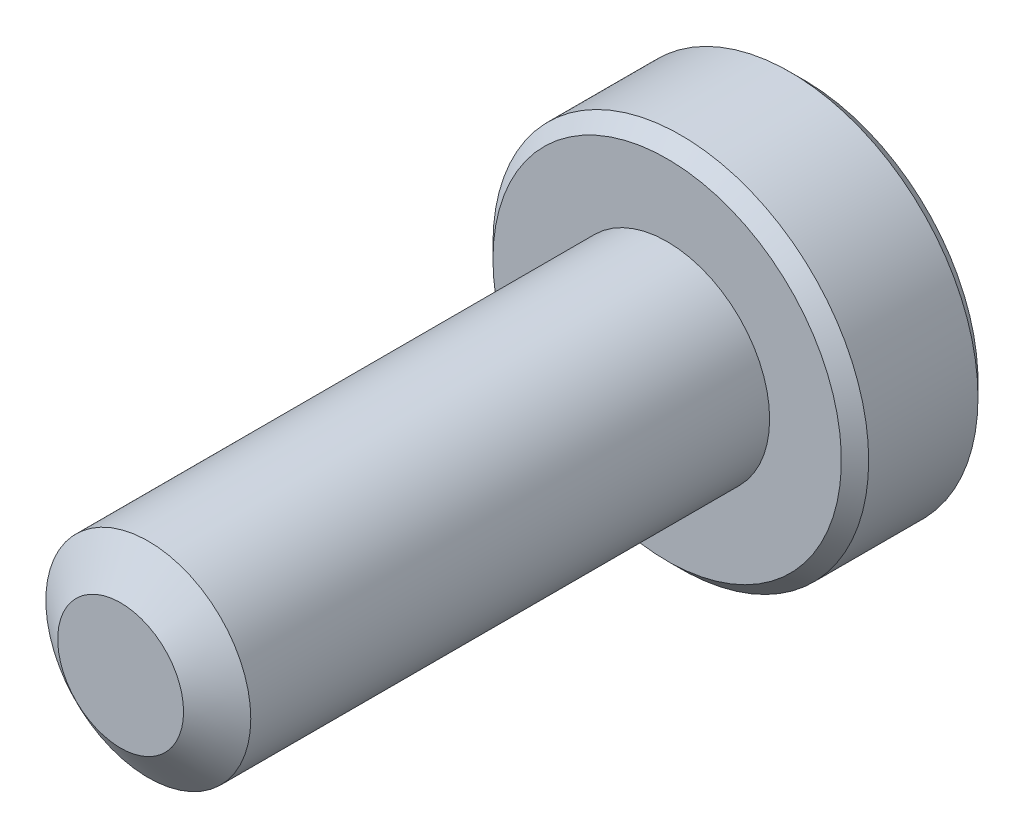
ISO-10303-21;
HEADER;
FILE_DESCRIPTION(('STEP AP214'),'2;1');
FILE_NAME('part.step','',(''),(''),'','','');
FILE_SCHEMA(('AUTOMOTIVE_DESIGN { 1 0 10303 214 1 1 1 1 }'));
ENDSEC;
DATA;
#1=APPLICATION_CONTEXT('core data for automotive mechanical design processes');
#2=APPLICATION_PROTOCOL_DEFINITION('international standard','automotive_design',2000,#1);
#3=PRODUCT_CONTEXT('',#1,'mechanical');
#4=PRODUCT('Part','Part','',(#3));
#5=PRODUCT_RELATED_PRODUCT_CATEGORY('part','',(#4));
#6=PRODUCT_DEFINITION_FORMATION('','',#4);
#7=PRODUCT_DEFINITION_CONTEXT('part definition',#1,'design');
#8=PRODUCT_DEFINITION('design','',#6,#7);
#9=PRODUCT_DEFINITION_SHAPE('','',#8);
#10=(LENGTH_UNIT() NAMED_UNIT(*) SI_UNIT(.MILLI.,.METRE.));
#11=(NAMED_UNIT(*) PLANE_ANGLE_UNIT() SI_UNIT($,.RADIAN.));
#12=(NAMED_UNIT(*) SI_UNIT($,.STERADIAN.) SOLID_ANGLE_UNIT());
#13=UNCERTAINTY_MEASURE_WITH_UNIT(LENGTH_MEASURE(1.E-05),#10,'distance_accuracy_value','');
#14=(GEOMETRIC_REPRESENTATION_CONTEXT(3) GLOBAL_UNCERTAINTY_ASSIGNED_CONTEXT((#13)) GLOBAL_UNIT_ASSIGNED_CONTEXT((#10,
#11,#12)) REPRESENTATION_CONTEXT('',''));
#15=CARTESIAN_POINT('',(0.,0.,0.));
#16=DIRECTION('',(0.,0.,1.));
#17=DIRECTION('',(1.,0.,0.));
#18=AXIS2_PLACEMENT_3D('',#15,#16,#17);
#19=CARTESIAN_POINT('',(0.,0.,-8.));
#20=DIRECTION('',(0.,0.,1.));
#21=DIRECTION('',(1.,0.,0.));
#22=AXIS2_PLACEMENT_3D('',#19,#20,#21);
#23=CYLINDRICAL_SURFACE('',#22,1.5);
#24=CARTESIAN_POINT('',(0.,0.,-8.));
#25=DIRECTION('',(0.,0.,-1.));
#26=DIRECTION('',(-1.,0.,0.));
#27=AXIS2_PLACEMENT_3D('',#24,#25,#26);
#28=CIRCLE('',#27,1.5);
#29=CARTESIAN_POINT('',(-1.5,0.,-8.));
#30=VERTEX_POINT('',#29);
#31=EDGE_CURVE('E211',#30,#30,#28,.F.);
#32=ORIENTED_EDGE('',*,*,#31,.T.);
#33=EDGE_LOOP('',(#32));
#34=FACE_BOUND('',#33,.T.);
#35=CARTESIAN_POINT('',(0.,0.,-0.40525178320938));
#36=DIRECTION('',(0.,0.,1.));
#37=DIRECTION('',(1.,0.,0.));
#38=AXIS2_PLACEMENT_3D('',#35,#36,#37);
#39=CIRCLE('',#38,1.5);
#40=CARTESIAN_POINT('',(1.5,0.,-0.40525178320938));
#41=VERTEX_POINT('',#40);
#42=EDGE_CURVE('E108',#41,#41,#39,.T.);
#43=ORIENTED_EDGE('',*,*,#42,.F.);
#44=EDGE_LOOP('',(#43));
#45=FACE_BOUND('',#44,.T.);
#46=ADVANCED_FACE('F34',(#34,#45),#23,.T.);
#47=CARTESIAN_POINT('',(0.,0.,0.));
#48=DIRECTION('',(0.,0.,-1.));
#49=DIRECTION('',(-1.,0.,0.));
#50=AXIS2_PLACEMENT_3D('',#47,#48,#49);
#51=CONICAL_SURFACE('',#50,0.921240473580833,0.959931088596884);
#52=ORIENTED_EDGE('',*,*,#42,.T.);
#53=EDGE_LOOP('',(#52));
#54=FACE_BOUND('',#53,.T.);
#55=CARTESIAN_POINT('',(0.,0.,0.));
#56=DIRECTION('',(0.,0.,1.));
#57=DIRECTION('',(1.,0.,0.));
#58=AXIS2_PLACEMENT_3D('',#55,#56,#57);
#59=CIRCLE('',#58,0.921240473580833);
#60=CARTESIAN_POINT('',(0.921240473580833,0.,0.));
#61=VERTEX_POINT('',#60);
#62=EDGE_CURVE('E209',#61,#61,#59,.T.);
#63=ORIENTED_EDGE('',*,*,#62,.F.);
#64=EDGE_LOOP('',(#63));
#65=FACE_BOUND('',#64,.T.);
#66=ADVANCED_FACE('F192',(#54,#65),#51,.T.);
#67=CARTESIAN_POINT('',(0.,0.,0.));
#68=DIRECTION('',(0.,0.,1.));
#69=DIRECTION('',(1.,0.,0.));
#70=AXIS2_PLACEMENT_3D('',#67,#68,#69);
#71=PLANE('',#70);
#72=ORIENTED_EDGE('',*,*,#62,.T.);
#73=EDGE_LOOP('',(#72));
#74=FACE_BOUND('',#73,.T.);
#75=ADVANCED_FACE('F189',(#74),#71,.T.);
#76=CARTESIAN_POINT('',(0.,0.,-10.));
#77=DIRECTION('',(0.,0.,1.));
#78=DIRECTION('',(1.,0.,0.));
#79=AXIS2_PLACEMENT_3D('',#76,#77,#78);
#80=CYLINDRICAL_SURFACE('',#79,2.75);
#81=CARTESIAN_POINT('',(0.,0.,-9.8));
#82=DIRECTION('',(0.,0.,-1.));
#83=DIRECTION('',(-1.,0.,0.));
#84=AXIS2_PLACEMENT_3D('',#81,#82,#83);
#85=CIRCLE('',#84,2.75);
#86=CARTESIAN_POINT('',(-2.75,0.,-9.8));
#87=VERTEX_POINT('',#86);
#88=EDGE_CURVE('E42',#87,#87,#85,.F.);
#89=ORIENTED_EDGE('',*,*,#88,.T.);
#90=EDGE_LOOP('',(#89));
#91=FACE_BOUND('',#90,.T.);
#92=CARTESIAN_POINT('',(0.,0.,-8.2));
#93=DIRECTION('',(0.,0.,-1.));
#94=DIRECTION('',(-1.,0.,0.));
#95=AXIS2_PLACEMENT_3D('',#92,#93,#94);
#96=CIRCLE('',#95,2.75);
#97=CARTESIAN_POINT('',(-2.75,0.,-8.2));
#98=VERTEX_POINT('',#97);
#99=EDGE_CURVE('E168',#98,#98,#96,.T.);
#100=ORIENTED_EDGE('',*,*,#99,.T.);
#101=EDGE_LOOP('',(#100));
#102=FACE_BOUND('',#101,.T.);
#103=ADVANCED_FACE('F173',(#91,#102),#80,.T.);
#104=CARTESIAN_POINT('',(0.,0.,-10.));
#105=DIRECTION('',(0.,0.,-1.));
#106=DIRECTION('',(-1.,0.,0.));
#107=AXIS2_PLACEMENT_3D('',#104,#105,#106);
#108=PLANE('',#107);
#109=CARTESIAN_POINT('',(0.,0.,-10.));
#110=DIRECTION('',(0.,0.,-1.));
#111=DIRECTION('',(-1.,0.,0.));
#112=AXIS2_PLACEMENT_3D('',#109,#110,#111);
#113=CIRCLE('',#112,2.55);
#114=CARTESIAN_POINT('',(-2.55,0.,-10.));
#115=VERTEX_POINT('',#114);
#116=EDGE_CURVE('E107',#115,#115,#113,.T.);
#117=ORIENTED_EDGE('',*,*,#116,.T.);
#118=EDGE_LOOP('',(#117));
#119=FACE_BOUND('',#118,.T.);
#120=CARTESIAN_POINT('',(0.,0.,-10.));
#121=DIRECTION('',(0.,0.,-1.));
#122=DIRECTION('',(-1.,0.,0.));
#123=AXIS2_PLACEMENT_3D('',#120,#121,#122);
#124=CIRCLE('',#123,1.15470053837925);
#125=CARTESIAN_POINT('',(-0.999999999999999,0.577350269189628,-10.));
#126=VERTEX_POINT('',#125);
#127=CARTESIAN_POINT('',(0.,1.15470053837925,-10.));
#128=VERTEX_POINT('',#127);
#129=EDGE_CURVE('E88',#126,#128,#124,.T.);
#130=ORIENTED_EDGE('',*,*,#129,.F.);
#131=CARTESIAN_POINT('',(-0.999999999999999,-0.577350269189626,-10.));
#132=VERTEX_POINT('',#131);
#133=EDGE_CURVE('E48',#132,#126,#124,.T.);
#134=ORIENTED_EDGE('',*,*,#133,.F.);
#135=CARTESIAN_POINT('',(0.,-1.15470053837925,-10.));
#136=VERTEX_POINT('',#135);
#137=EDGE_CURVE('E267',#136,#132,#124,.T.);
#138=ORIENTED_EDGE('',*,*,#137,.F.);
#139=CARTESIAN_POINT('',(0.999999999999999,-0.577350269189627,-10.));
#140=VERTEX_POINT('',#139);
#141=EDGE_CURVE('E55',#140,#136,#124,.T.);
#142=ORIENTED_EDGE('',*,*,#141,.F.);
#143=CARTESIAN_POINT('',(0.999999999999999,0.577350269189627,-10.));
#144=VERTEX_POINT('',#143);
#145=EDGE_CURVE('E129',#144,#140,#124,.T.);
#146=ORIENTED_EDGE('',*,*,#145,.F.);
#147=EDGE_CURVE('E97',#128,#144,#124,.T.);
#148=ORIENTED_EDGE('',*,*,#147,.F.);
#149=EDGE_LOOP('',(#130,#134,#138,#142,#146,#148));
#150=FACE_BOUND('',#149,.T.);
#151=ADVANCED_FACE('F128',(#119,#150),#108,.T.);
#152=CARTESIAN_POINT('',(0.,0.,-8.));
#153=DIRECTION('',(0.,0.,-1.));
#154=DIRECTION('',(-1.,0.,0.));
#155=AXIS2_PLACEMENT_3D('',#152,#153,#154);
#156=PLANE('',#155);
#157=CARTESIAN_POINT('',(0.,0.,-8.));
#158=DIRECTION('',(0.,0.,-1.));
#159=DIRECTION('',(-1.,0.,0.));
#160=AXIS2_PLACEMENT_3D('',#157,#158,#159);
#161=CIRCLE('',#160,2.55);
#162=CARTESIAN_POINT('',(-2.55,0.,-8.));
#163=VERTEX_POINT('',#162);
#164=EDGE_CURVE('E11',#163,#163,#161,.F.);
#165=ORIENTED_EDGE('',*,*,#164,.T.);
#166=EDGE_LOOP('',(#165));
#167=FACE_BOUND('',#166,.T.);
#168=ORIENTED_EDGE('',*,*,#31,.F.);
#169=EDGE_LOOP('',(#168));
#170=FACE_BOUND('',#169,.T.);
#171=ADVANCED_FACE('F182',(#167,#170),#156,.F.);
#172=CARTESIAN_POINT('',(0.,0.,-10.));
#173=DIRECTION('',(0.,0.,-1.));
#174=DIRECTION('',(-1.,0.,0.));
#175=AXIS2_PLACEMENT_3D('',#172,#173,#174);
#176=CONICAL_SURFACE('',#175,1.15470053837925,0.78539816339745);
#177=ORIENTED_EDGE('',*,*,#147,.T.);
#178=CARTESIAN_POINT('',(-0.000199999999999368,1.15481600843309,-10.0001154873726));
#179=CARTESIAN_POINT('',(0.0341825950071807,1.13496520795026,-9.98027793082573));
#180=CARTESIAN_POINT('',(0.0691401181398249,1.11478247255942,-9.96160502063889));
#181=CARTESIAN_POINT('',(0.14042280295609,1.07362739529219,-9.92741474272316));
#182=CARTESIAN_POINT('',(0.176754750528985,1.0526511355808,-9.91191640902346));
#183=CARTESIAN_POINT('',(0.250016613803312,1.01035337909803,-9.88536730714227));
#184=CARTESIAN_POINT('',(0.286927851445415,0.989042666109241,-9.87424977399693));
#185=CARTESIAN_POINT('',(0.36156272931086,0.945952199282691,-9.85711986577618));
#186=CARTESIAN_POINT('',(0.399284088108636,0.924173762626597,-9.85109469746667));
#187=CARTESIAN_POINT('',(0.464292198417934,0.886641312640015,-9.84566055496749));
#188=CARTESIAN_POINT('',(0.491494371528173,0.870936130672276,-9.84485693831673));
#189=CARTESIAN_POINT('',(0.545846040669113,0.839556179862849,-9.84620669941689));
#190=CARTESIAN_POINT('',(0.572995523754876,0.823881418494924,-9.8483607295472));
#191=CARTESIAN_POINT('',(0.654056277326961,0.777080970599367,-9.85911697212847));
#192=CARTESIAN_POINT('',(0.707564140978428,0.74618819111643,-9.87201455641536));
#193=CARTESIAN_POINT('',(0.801476065143432,0.69196811641965,-9.90314073060218));
#194=CARTESIAN_POINT('',(0.842320523671835,0.668386557293372,-9.91973779770184));
#195=CARTESIAN_POINT('',(0.922409637381944,0.622147085933682,-9.95712492468529));
#196=CARTESIAN_POINT('',(0.961659010870438,0.599486449584576,-9.97790134181741));
#197=CARTESIAN_POINT('',(1.0002,0.577234799135788,-10.0001154873726));
#198=B_SPLINE_CURVE_WITH_KNOTS('',3,(#178,#179,#180,#181,#182,#183,#184,#185,#186,#187,#188,
#189,#190,#191,#192,#193,#194,#195,#196,#197),.UNSPECIFIED.,.F.,.F.,(4,2,2,2,2,2,2,2,2,4),(0.,
0.133237676828559,0.267252229834491,0.399137076269301,0.530689603280768,0.624814864263846,
0.718960890149133,0.907306626112098,1.05710100361789,1.20641411519286),.UNSPECIFIED.);
#199=EDGE_CURVE('E102',#128,#144,#198,.T.);
#200=ORIENTED_EDGE('',*,*,#199,.F.);
#201=EDGE_LOOP('',(#177,#200));
#202=FACE_BOUND('',#201,.T.);
#203=ADVANCED_FACE('F103',(#202),#176,.F.);
#204=ORIENTED_EDGE('',*,*,#145,.T.);
#205=CARTESIAN_POINT('',(0.999999999999999,-1.15147208646461,-10.3703856775139));
#206=CARTESIAN_POINT('',(0.999999999999999,-1.12343447988552,-10.3492199198737));
#207=CARTESIAN_POINT('',(0.999999999999999,-1.09524064850697,-10.3282616921759));
#208=CARTESIAN_POINT('',(0.999999999999999,-1.03847715644376,-10.2868460222356));
#209=CARTESIAN_POINT('',(0.999999999999999,-1.00990740382975,-10.2663887061237));
#210=CARTESIAN_POINT('',(0.999999999999999,-0.923120894333475,-10.2056047949545));
#211=CARTESIAN_POINT('',(0.999999999999999,-0.864253173759058,-10.1661922289614));
#212=CARTESIAN_POINT('',(0.999999999999999,-0.740809858258044,-10.0888206642002));
#213=CARTESIAN_POINT('',(1.,-0.676100255137806,-10.0510730391143));
#214=CARTESIAN_POINT('',(1.,-0.543448939049123,-9.98202458755129));
#215=CARTESIAN_POINT('',(0.999999999999999,-0.475519112027778,-9.95070202784686));
#216=CARTESIAN_POINT('',(1.,-0.373555850333528,-9.91238177888379));
#217=CARTESIAN_POINT('',(1.,-0.341031989670907,-9.90138359164215));
#218=CARTESIAN_POINT('',(1.,-0.275199079052293,-9.88199834214736));
#219=CARTESIAN_POINT('',(1.,-0.241889975173932,-9.8736114597767));
#220=CARTESIAN_POINT('',(1.,-0.175247517042992,-9.86002522071901));
#221=CARTESIAN_POINT('',(1.,-0.141925568218175,-9.85477079076797));
#222=CARTESIAN_POINT('',(1.,-0.0749144362322789,-9.84754868657089));
#223=CARTESIAN_POINT('',(1.,-0.041225197850162,-9.84558151361051));
#224=CARTESIAN_POINT('',(1.,0.0249580992634205,-9.84508319839316));
#225=CARTESIAN_POINT('',(1.,0.0574512826460387,-9.84643026788863));
#226=CARTESIAN_POINT('',(1.,0.122148505701866,-9.85221648449899));
#227=CARTESIAN_POINT('',(1.,0.154352610132926,-9.85665492066153));
#228=CARTESIAN_POINT('',(1.,0.218799898867639,-9.8684568301452));
#229=CARTESIAN_POINT('',(1.,0.251033743268952,-9.87587054103851));
#230=CARTESIAN_POINT('',(1.,0.314797132354918,-9.89322894249868));
#231=CARTESIAN_POINT('',(1.,0.346326735731004,-9.90317342128883));
#232=CARTESIAN_POINT('',(1.,0.445594187730204,-9.93822348255434));
#233=CARTESIAN_POINT('',(1.,0.511919139476036,-9.96732085835672));
#234=CARTESIAN_POINT('',(1.,0.641453244657531,-10.0320153296865));
#235=CARTESIAN_POINT('',(1.,0.704650133126343,-10.0676357767152));
#236=CARTESIAN_POINT('',(1.,0.825428490174985,-10.1411239013469));
#237=CARTESIAN_POINT('',(1.,0.883132947867683,-10.1787919471355));
#238=CARTESIAN_POINT('',(1.,0.968148853704564,-10.2370228529432));
#239=CARTESIAN_POINT('',(1.,0.996120570380284,-10.2566384757629));
#240=CARTESIAN_POINT('',(1.,1.05168177729901,-10.2963885170613));
#241=CARTESIAN_POINT('',(1.,1.079271369977,-10.3165227921988));
#242=CARTESIAN_POINT('',(1.,1.10670185346329,-10.336872119073));
#243=B_SPLINE_CURVE_WITH_KNOTS('',3,(#205,#206,#207,#208,#209,#210,#211,#212,#213,#214,#215,
#216,#217,#218,#219,#220,#221,#222,#223,#224,#225,#226,#227,#228,#229,#230,#231,#232,#233,#234,
#235,#236,#237,#238,#239,#240,#241,#242),.UNSPECIFIED.,.F.,.F.,(4,2,2,2,2,2,2,2,2,2,2,2,2,2,2,2,
2,2,4),(0.,0.10538645908329,0.210799187330122,0.423233611565467,0.647793540908502,
0.871580877738607,0.974493074181418,1.07741235827201,1.17846428203204,1.27953161415762,
1.3769408673961,1.47432772585407,1.57343322804293,1.67253043972851,1.88917353996827,
2.10660791038812,2.31323734249843,2.41572589232044,2.51818641476503),.UNSPECIFIED.);
#244=EDGE_CURVE('E96',#144,#140,#243,.F.);
#245=ORIENTED_EDGE('',*,*,#244,.F.);
#246=EDGE_LOOP('',(#204,#245));
#247=FACE_BOUND('',#246,.T.);
#248=ADVANCED_FACE('F273',(#247),#176,.F.);
#249=ORIENTED_EDGE('',*,*,#141,.T.);
#250=CARTESIAN_POINT('',(1.0002,-0.577234799135788,-10.0001154873726));
#251=CARTESIAN_POINT('',(0.965817404992819,-0.597085599618621,-9.98027793082573));
#252=CARTESIAN_POINT('',(0.930859881860175,-0.617268335009456,-9.96160502063889));
#253=CARTESIAN_POINT('',(0.85957719704391,-0.658423412276685,-9.92741474272316));
#254=CARTESIAN_POINT('',(0.823245249471016,-0.679399671988079,-9.91191640902346));
#255=CARTESIAN_POINT('',(0.749983386196688,-0.721697428470846,-9.88536730714226));
#256=CARTESIAN_POINT('',(0.713072148554585,-0.743008141459636,-9.87424977399693));
#257=CARTESIAN_POINT('',(0.63843727068914,-0.786098608286186,-9.85711986577618));
#258=CARTESIAN_POINT('',(0.600715911891364,-0.80787704494228,-9.85109469746667));
#259=CARTESIAN_POINT('',(0.535707801582066,-0.845409494928862,-9.84566055496749));
#260=CARTESIAN_POINT('',(0.508505628471827,-0.861114676896601,-9.84485693831673));
#261=CARTESIAN_POINT('',(0.454153959330887,-0.892494627706028,-9.84620669941689));
#262=CARTESIAN_POINT('',(0.427004476245124,-0.908169389073953,-9.8483607295472));
#263=CARTESIAN_POINT('',(0.345943722673039,-0.95496983696951,-9.85911697212847));
#264=CARTESIAN_POINT('',(0.292435859021572,-0.985862616452447,-9.87201455641535));
#265=CARTESIAN_POINT('',(0.198523934856568,-1.04008269114923,-9.90314073060218));
#266=CARTESIAN_POINT('',(0.157679476328165,-1.06366425027551,-9.91973779770184));
#267=CARTESIAN_POINT('',(0.0775903626180563,-1.1099037216352,-9.95712492468529));
#268=CARTESIAN_POINT('',(0.0383409891295624,-1.1325643579843,-9.9779013418174));
#269=CARTESIAN_POINT('',(-0.000199999999999969,-1.15481600843309,-10.0001154873726));
#270=B_SPLINE_CURVE_WITH_KNOTS('',3,(#250,#251,#252,#253,#254,#255,#256,#257,#258,#259,#260,
#261,#262,#263,#264,#265,#266,#267,#268,#269),.UNSPECIFIED.,.F.,.F.,(4,2,2,2,2,2,2,2,2,4),(0.,
0.133237676828558,0.26725222983449,0.3991370762693,0.530689603280768,0.624814864263846,
0.718960890149133,0.907306626112097,1.05710100361789,1.20641411519286),.UNSPECIFIED.);
#271=EDGE_CURVE('E138',#140,#136,#270,.T.);
#272=ORIENTED_EDGE('',*,*,#271,.F.);
#273=EDGE_LOOP('',(#249,#272));
#274=FACE_BOUND('',#273,.T.);
#275=ADVANCED_FACE('F270',(#274),#176,.F.);
#276=ORIENTED_EDGE('',*,*,#137,.T.);
#277=CARTESIAN_POINT('',(0.000199999999999605,-1.15481600843309,-10.0001154873726));
#278=CARTESIAN_POINT('',(-0.0341825950071812,-1.13496520795025,-9.98027793082573));
#279=CARTESIAN_POINT('',(-0.0691401181398254,-1.11478247255942,-9.96160502063889));
#280=CARTESIAN_POINT('',(-0.14042280295609,-1.07362739529219,-9.92741474272316));
#281=CARTESIAN_POINT('',(-0.176754750528984,-1.0526511355808,-9.91191640902346));
#282=CARTESIAN_POINT('',(-0.250016613803311,-1.01035337909803,-9.88536730714227));
#283=CARTESIAN_POINT('',(-0.286927851445414,-0.98904266610924,-9.87424977399693));
#284=CARTESIAN_POINT('',(-0.361562729310859,-0.945952199282691,-9.85711986577618));
#285=CARTESIAN_POINT('',(-0.399284088108635,-0.924173762626596,-9.85109469746667));
#286=CARTESIAN_POINT('',(-0.464292198417933,-0.886641312640015,-9.84566055496749));
#287=CARTESIAN_POINT('',(-0.491494371528171,-0.870936130672275,-9.84485693831673));
#288=CARTESIAN_POINT('',(-0.545846040669111,-0.839556179862848,-9.84620669941689));
#289=CARTESIAN_POINT('',(-0.572995523754875,-0.823881418494924,-9.8483607295472));
#290=CARTESIAN_POINT('',(-0.654056277326959,-0.777080970599367,-9.85911697212847));
#291=CARTESIAN_POINT('',(-0.707564140978426,-0.74618819111643,-9.87201455641535));
#292=CARTESIAN_POINT('',(-0.80147606514343,-0.69196811641965,-9.90314073060218));
#293=CARTESIAN_POINT('',(-0.842320523671833,-0.668386557293372,-9.91973779770184));
#294=CARTESIAN_POINT('',(-0.922409637381942,-0.622147085933682,-9.95712492468529));
#295=CARTESIAN_POINT('',(-0.961659010870436,-0.599486449584575,-9.9779013418174));
#296=CARTESIAN_POINT('',(-1.0002,-0.577234799135788,-10.0001154873726));
#297=B_SPLINE_CURVE_WITH_KNOTS('',3,(#277,#278,#279,#280,#281,#282,#283,#284,#285,#286,#287,
#288,#289,#290,#291,#292,#293,#294,#295,#296),.UNSPECIFIED.,.F.,.F.,(4,2,2,2,2,2,2,2,2,4),(0.,
0.133237676828559,0.267252229834489,0.399137076269299,0.530689603280766,0.624814864263844,
0.718960890149131,0.907306626112095,1.05710100361789,1.20641411519286),.UNSPECIFIED.);
#298=EDGE_CURVE('E245',#136,#132,#297,.T.);
#299=ORIENTED_EDGE('',*,*,#298,.F.);
#300=EDGE_LOOP('',(#276,#299));
#301=FACE_BOUND('',#300,.T.);
#302=ADVANCED_FACE('F269',(#301),#176,.F.);
#303=ORIENTED_EDGE('',*,*,#133,.T.);
#304=CARTESIAN_POINT('',(-0.999999999999999,-1.15147208663215,-10.3703856776404));
#305=CARTESIAN_POINT('',(-0.999999999999999,-1.12343448004835,-10.3492199199953));
#306=CARTESIAN_POINT('',(-0.999999999999999,-1.09524064866509,-10.3282616922927));
#307=CARTESIAN_POINT('',(-0.999999999999999,-1.0384771565924,-10.2868460223427));
#308=CARTESIAN_POINT('',(-0.999999999999999,-1.00990740397363,-10.2663887062259));
#309=CARTESIAN_POINT('',(-0.999999999999999,-0.923120894462776,-10.2056047950421));
#310=CARTESIAN_POINT('',(-0.999999999999999,-0.864253173878445,-10.1661922290393));
#311=CARTESIAN_POINT('',(-0.999999999999999,-0.740809858355812,-10.0888206642582));
#312=CARTESIAN_POINT('',(-0.999999999999999,-0.67610025522381,-10.0510730391622));
#313=CARTESIAN_POINT('',(-0.999999999999999,-0.543448939110599,-9.98202458758025));
#314=CARTESIAN_POINT('',(-0.999999999999999,-0.475519112076497,-9.95070202786713));
#315=CARTESIAN_POINT('',(-0.999999999999999,-0.373555850372648,-9.9123817788976));
#316=CARTESIAN_POINT('',(-0.999999999999999,-0.341031989714046,-9.90138359165621));
#317=CARTESIAN_POINT('',(-0.999999999999999,-0.275199079103601,-9.88199834216111));
#318=CARTESIAN_POINT('',(-0.999999999999999,-0.241889975229392,-9.87361145978989));
#319=CARTESIAN_POINT('',(-0.999999999999999,-0.175247517106615,-9.86002522073014));
#320=CARTESIAN_POINT('',(-0.999999999999999,-0.141925568285807,-9.85477079077761));
#321=CARTESIAN_POINT('',(-0.999999999999999,-0.0749144363078009,-9.84754868657667));
#322=CARTESIAN_POINT('',(-0.999999999999999,-0.0412251979295627,-9.8455815136139));
#323=CARTESIAN_POINT('',(-0.999999999999999,0.0249580991768642,-9.84508319839111));
#324=CARTESIAN_POINT('',(-0.999999999999999,0.0574512825561957,-9.84643026788357));
#325=CARTESIAN_POINT('',(-0.999999999999999,0.122148505605778,-9.85221648448742));
#326=CARTESIAN_POINT('',(-0.999999999999999,0.15435261003388,-9.85665492064649));
#327=CARTESIAN_POINT('',(-0.999999999999999,0.218799898762754,-9.86845683012285));
#328=CARTESIAN_POINT('',(-0.999999999999999,0.251033743161196,-9.87587054101231));
#329=CARTESIAN_POINT('',(-0.999999999999999,0.314797132241694,-9.89322894246471));
#330=CARTESIAN_POINT('',(-0.999999999999999,0.346326735615184,-9.90317342125094));
#331=CARTESIAN_POINT('',(-0.999999999999999,0.445594187589164,-9.93822348249794));
#332=CARTESIAN_POINT('',(-0.999999999999999,0.511919139313634,-9.9673208582833));
#333=CARTESIAN_POINT('',(-0.999999999999999,0.641453244454048,-10.0320153295771));
#334=CARTESIAN_POINT('',(-0.999999999999999,0.70465013290315,-10.067635776587));
#335=CARTESIAN_POINT('',(-0.999999999999999,0.825428489916356,-10.1411239011824));
#336=CARTESIAN_POINT('',(-0.999999999999999,0.883132947593201,-10.1787919469539));
#337=CARTESIAN_POINT('',(-0.999999999999999,0.968148853406641,-10.2370228527359));
#338=CARTESIAN_POINT('',(-0.999999999999999,0.99612057007466,-10.2566384755472));
#339=CARTESIAN_POINT('',(-0.999999999999999,1.05168177697804,-10.2963885168287));
#340=CARTESIAN_POINT('',(-0.999999999999999,1.07927136964837,-10.3165227919578));
#341=CARTESIAN_POINT('',(-0.999999999999999,1.10670185312703,-10.3368721188235));
#342=B_SPLINE_CURVE_WITH_KNOTS('',3,(#304,#305,#306,#307,#308,#309,#310,#311,#312,#313,#314,
#315,#316,#317,#318,#319,#320,#321,#322,#323,#324,#325,#326,#327,#328,#329,#330,#331,#332,#333,
#334,#335,#336,#337,#338,#339,#340,#341),.UNSPECIFIED.,.F.,.F.,(4,2,2,2,2,2,2,2,2,2,2,2,2,2,2,2,
2,2,4),(0.,0.105386459103349,0.210799187370247,0.423233611646472,0.647793541035349,
0.871580877910864,0.974493074342054,1.07741235842104,1.17846428216995,1.2795316142844,
1.37694086751269,1.47432772596047,1.57343322813835,1.67253043981296,1.88917353997386,
2.10660791031433,2.31323734235672,2.41572589214523,2.51818641455632),.UNSPECIFIED.);
#343=EDGE_CURVE('E118',#132,#126,#342,.T.);
#344=ORIENTED_EDGE('',*,*,#343,.F.);
#345=EDGE_LOOP('',(#303,#344));
#346=FACE_BOUND('',#345,.T.);
#347=ADVANCED_FACE('F282',(#346),#176,.F.);
#348=ORIENTED_EDGE('',*,*,#129,.T.);
#349=CARTESIAN_POINT('',(-1.0002,0.577234799135789,-10.0001154873726));
#350=CARTESIAN_POINT('',(-0.965817404992818,0.597085599618623,-9.98027793082573));
#351=CARTESIAN_POINT('',(-0.930859881860174,0.617268335009457,-9.96160502063889));
#352=CARTESIAN_POINT('',(-0.859577197043909,0.658423412276687,-9.92741474272316));
#353=CARTESIAN_POINT('',(-0.823245249471015,0.679399671988081,-9.91191640902346));
#354=CARTESIAN_POINT('',(-0.749983386196688,0.721697428470847,-9.88536730714227));
#355=CARTESIAN_POINT('',(-0.713072148554584,0.743008141459637,-9.87424977399693));
#356=CARTESIAN_POINT('',(-0.638437270689139,0.786098608286187,-9.85711986577618));
#357=CARTESIAN_POINT('',(-0.600715911891363,0.807877044942282,-9.85109469746667));
#358=CARTESIAN_POINT('',(-0.535707801582065,0.845409494928863,-9.84566055496749));
#359=CARTESIAN_POINT('',(-0.508505628471827,0.861114676896602,-9.84485693831673));
#360=CARTESIAN_POINT('',(-0.454153959330887,0.892494627706029,-9.84620669941689));
#361=CARTESIAN_POINT('',(-0.427004476245123,0.908169389073954,-9.8483607295472));
#362=CARTESIAN_POINT('',(-0.345943722673039,0.954969836969511,-9.85911697212847));
#363=CARTESIAN_POINT('',(-0.292435859021571,0.985862616452448,-9.87201455641536));
#364=CARTESIAN_POINT('',(-0.198523934856567,1.04008269114923,-9.90314073060218));
#365=CARTESIAN_POINT('',(-0.157679476328165,1.06366425027551,-9.91973779770184));
#366=CARTESIAN_POINT('',(-0.0775903626180557,1.1099037216352,-9.95712492468529));
#367=CARTESIAN_POINT('',(-0.0383409891295619,1.1325643579843,-9.9779013418174));
#368=CARTESIAN_POINT('',(0.000200000000000272,1.15481600843309,-10.0001154873726));
#369=B_SPLINE_CURVE_WITH_KNOTS('',3,(#349,#350,#351,#352,#353,#354,#355,#356,#357,#358,#359,
#360,#361,#362,#363,#364,#365,#366,#367,#368),.UNSPECIFIED.,.F.,.F.,(4,2,2,2,2,2,2,2,2,4),(0.,
0.133237676828559,0.26725222983449,0.3991370762693,0.530689603280768,0.624814864263845,
0.718960890149133,0.907306626112097,1.05710100361789,1.20641411519286),.UNSPECIFIED.);
#370=EDGE_CURVE('E92',#126,#128,#369,.T.);
#371=ORIENTED_EDGE('',*,*,#370,.F.);
#372=EDGE_LOOP('',(#348,#371));
#373=FACE_BOUND('',#372,.T.);
#374=ADVANCED_FACE('F90',(#373),#176,.F.);
#375=CARTESIAN_POINT('',(-0.999999999999999,0.577350269189626,-8.5));
#376=DIRECTION('',(0.,0.,1.));
#377=DIRECTION('',(1.,0.,0.));
#378=AXIS2_PLACEMENT_3D('',#375,#376,#377);
#379=PLANE('',#378);
#380=DIRECTION('',(0.866025403784439,0.5,0.));
#381=VECTOR('',#380,1.);
#382=CARTESIAN_POINT('',(-0.999999999999999,0.577350269189627,-8.5));
#383=LINE('',#382,#381);
#384=CARTESIAN_POINT('',(-0.999999999999999,0.577350269189627,-8.5));
#385=VERTEX_POINT('',#384);
#386=CARTESIAN_POINT('',(0.,1.15470053837925,-8.5));
#387=VERTEX_POINT('',#386);
#388=EDGE_CURVE('E117',#385,#387,#383,.T.);
#389=ORIENTED_EDGE('',*,*,#388,.T.);
#390=DIRECTION('',(0.866025403784439,-0.5,0.));
#391=VECTOR('',#390,1.);
#392=CARTESIAN_POINT('',(0.,1.15470053837925,-8.5));
#393=LINE('',#392,#391);
#394=CARTESIAN_POINT('',(1.,0.577350269189626,-8.5));
#395=VERTEX_POINT('',#394);
#396=EDGE_CURVE('E122',#387,#395,#393,.T.);
#397=ORIENTED_EDGE('',*,*,#396,.T.);
#398=DIRECTION('',(0.,-1.,0.));
#399=VECTOR('',#398,1.);
#400=CARTESIAN_POINT('',(1.,0.577350269189626,-8.5));
#401=LINE('',#400,#399);
#402=CARTESIAN_POINT('',(1.,-0.577350269189625,-8.5));
#403=VERTEX_POINT('',#402);
#404=EDGE_CURVE('E233',#395,#403,#401,.T.);
#405=ORIENTED_EDGE('',*,*,#404,.T.);
#406=DIRECTION('',(-0.866025403784439,-0.5,0.));
#407=VECTOR('',#406,1.);
#408=CARTESIAN_POINT('',(1.,-0.577350269189625,-8.5));
#409=LINE('',#408,#407);
#410=CARTESIAN_POINT('',(0.,-1.15470053837925,-8.5));
#411=VERTEX_POINT('',#410);
#412=EDGE_CURVE('E230',#403,#411,#409,.T.);
#413=ORIENTED_EDGE('',*,*,#412,.T.);
#414=DIRECTION('',(-0.866025403784439,0.5,0.));
#415=VECTOR('',#414,1.);
#416=CARTESIAN_POINT('',(0.,-1.15470053837925,-8.5));
#417=LINE('',#416,#415);
#418=CARTESIAN_POINT('',(-0.999999999999999,-0.577350269189626,-8.5));
#419=VERTEX_POINT('',#418);
#420=EDGE_CURVE('E227',#411,#419,#417,.T.);
#421=ORIENTED_EDGE('',*,*,#420,.T.);
#422=DIRECTION('',(0.,1.,0.));
#423=VECTOR('',#422,1.);
#424=CARTESIAN_POINT('',(-0.999999999999999,-0.577350269189626,-8.5));
#425=LINE('',#424,#423);
#426=EDGE_CURVE('E125',#419,#385,#425,.T.);
#427=ORIENTED_EDGE('',*,*,#426,.T.);
#428=EDGE_LOOP('',(#389,#397,#405,#413,#421,#427));
#429=FACE_BOUND('',#428,.T.);
#430=ADVANCED_FACE('F157',(#429),#379,.F.);
#431=CARTESIAN_POINT('',(0.,1.15470053837925,-8.5));
#432=DIRECTION('',(0.5,0.866025403784439,0.));
#433=DIRECTION('',(-0.866025403784439,0.5,0.));
#434=AXIS2_PLACEMENT_3D('',#431,#432,#433);
#435=PLANE('',#434);
#436=DIRECTION('',(0.,0.,-1.));
#437=VECTOR('',#436,1.);
#438=CARTESIAN_POINT('',(0.,1.15470053837925,-8.5));
#439=LINE('',#438,#437);
#440=EDGE_CURVE('E114',#387,#128,#439,.T.);
#441=ORIENTED_EDGE('',*,*,#440,.T.);
#442=ORIENTED_EDGE('',*,*,#199,.T.);
#443=DIRECTION('',(0.,0.,-1.));
#444=VECTOR('',#443,1.);
#445=CARTESIAN_POINT('',(1.,0.577350269189626,-8.5));
#446=LINE('',#445,#444);
#447=EDGE_CURVE('E124',#395,#144,#446,.T.);
#448=ORIENTED_EDGE('',*,*,#447,.F.);
#449=ORIENTED_EDGE('',*,*,#396,.F.);
#450=EDGE_LOOP('',(#441,#442,#448,#449));
#451=FACE_BOUND('',#450,.T.);
#452=ADVANCED_FACE('F120',(#451),#435,.F.);
#453=CARTESIAN_POINT('',(1.,0.577350269189626,-8.5));
#454=DIRECTION('',(1.,0.,0.));
#455=DIRECTION('',(0.,1.,0.));
#456=AXIS2_PLACEMENT_3D('',#453,#454,#455);
#457=PLANE('',#456);
#458=ORIENTED_EDGE('',*,*,#447,.T.);
#459=ORIENTED_EDGE('',*,*,#244,.T.);
#460=DIRECTION('',(0.,0.,-1.));
#461=VECTOR('',#460,1.);
#462=CARTESIAN_POINT('',(1.,-0.577350269189625,-8.5));
#463=LINE('',#462,#461);
#464=EDGE_CURVE('E216',#403,#140,#463,.T.);
#465=ORIENTED_EDGE('',*,*,#464,.F.);
#466=ORIENTED_EDGE('',*,*,#404,.F.);
#467=EDGE_LOOP('',(#458,#459,#465,#466));
#468=FACE_BOUND('',#467,.T.);
#469=ADVANCED_FACE('F146',(#468),#457,.F.);
#470=CARTESIAN_POINT('',(1.,-0.577350269189625,-8.5));
#471=DIRECTION('',(0.5,-0.866025403784439,0.));
#472=DIRECTION('',(0.866025403784439,0.5,0.));
#473=AXIS2_PLACEMENT_3D('',#470,#471,#472);
#474=PLANE('',#473);
#475=ORIENTED_EDGE('',*,*,#464,.T.);
#476=ORIENTED_EDGE('',*,*,#271,.T.);
#477=DIRECTION('',(0.,0.,-1.));
#478=VECTOR('',#477,1.);
#479=CARTESIAN_POINT('',(0.,-1.15470053837925,-8.5));
#480=LINE('',#479,#478);
#481=EDGE_CURVE('E219',#411,#136,#480,.T.);
#482=ORIENTED_EDGE('',*,*,#481,.F.);
#483=ORIENTED_EDGE('',*,*,#412,.F.);
#484=EDGE_LOOP('',(#475,#476,#482,#483));
#485=FACE_BOUND('',#484,.T.);
#486=ADVANCED_FACE('F150',(#485),#474,.F.);
#487=CARTESIAN_POINT('',(0.,-1.15470053837925,-8.5));
#488=DIRECTION('',(-0.5,-0.866025403784439,0.));
#489=DIRECTION('',(0.866025403784439,-0.5,0.));
#490=AXIS2_PLACEMENT_3D('',#487,#488,#489);
#491=PLANE('',#490);
#492=ORIENTED_EDGE('',*,*,#481,.T.);
#493=ORIENTED_EDGE('',*,*,#298,.T.);
#494=DIRECTION('',(0.,0.,-1.));
#495=VECTOR('',#494,1.);
#496=CARTESIAN_POINT('',(-0.999999999999999,-0.577350269189626,-8.5));
#497=LINE('',#496,#495);
#498=EDGE_CURVE('E222',#419,#132,#497,.T.);
#499=ORIENTED_EDGE('',*,*,#498,.F.);
#500=ORIENTED_EDGE('',*,*,#420,.F.);
#501=EDGE_LOOP('',(#492,#493,#499,#500));
#502=FACE_BOUND('',#501,.T.);
#503=ADVANCED_FACE('F252',(#502),#491,.F.);
#504=CARTESIAN_POINT('',(-0.999999999999999,-0.577350269189626,-8.5));
#505=DIRECTION('',(-1.,0.,0.));
#506=DIRECTION('',(0.,-1.,0.));
#507=AXIS2_PLACEMENT_3D('',#504,#505,#506);
#508=PLANE('',#507);
#509=ORIENTED_EDGE('',*,*,#498,.T.);
#510=ORIENTED_EDGE('',*,*,#343,.T.);
#511=DIRECTION('',(0.,0.,-1.));
#512=VECTOR('',#511,1.);
#513=CARTESIAN_POINT('',(-0.999999999999999,0.577350269189627,-8.5));
#514=LINE('',#513,#512);
#515=EDGE_CURVE('E116',#385,#126,#514,.T.);
#516=ORIENTED_EDGE('',*,*,#515,.F.);
#517=ORIENTED_EDGE('',*,*,#426,.F.);
#518=EDGE_LOOP('',(#509,#510,#516,#517));
#519=FACE_BOUND('',#518,.T.);
#520=ADVANCED_FACE('F249',(#519),#508,.F.);
#521=CARTESIAN_POINT('',(-0.999999999999999,0.577350269189627,-8.5));
#522=DIRECTION('',(-0.5,0.866025403784439,0.));
#523=DIRECTION('',(-0.866025403784439,-0.5,0.));
#524=AXIS2_PLACEMENT_3D('',#521,#522,#523);
#525=PLANE('',#524);
#526=ORIENTED_EDGE('',*,*,#515,.T.);
#527=ORIENTED_EDGE('',*,*,#370,.T.);
#528=ORIENTED_EDGE('',*,*,#440,.F.);
#529=ORIENTED_EDGE('',*,*,#388,.F.);
#530=EDGE_LOOP('',(#526,#527,#528,#529));
#531=FACE_BOUND('',#530,.T.);
#532=ADVANCED_FACE('F112',(#531),#525,.F.);
#533=CARTESIAN_POINT('',(0.,0.,-10.));
#534=DIRECTION('',(0.,0.,1.));
#535=DIRECTION('',(1.,0.,0.));
#536=AXIS2_PLACEMENT_3D('',#533,#534,#535);
#537=CONICAL_SURFACE('',#536,2.55,0.785398163397446);
#538=ORIENTED_EDGE('',*,*,#88,.F.);
#539=EDGE_LOOP('',(#538));
#540=FACE_BOUND('',#539,.T.);
#541=ORIENTED_EDGE('',*,*,#116,.F.);
#542=EDGE_LOOP('',(#541));
#543=FACE_BOUND('',#542,.T.);
#544=ADVANCED_FACE('F176',(#540,#543),#537,.T.);
#545=CARTESIAN_POINT('',(0.,0.,-8.2));
#546=DIRECTION('',(0.,0.,-1.));
#547=DIRECTION('',(-1.,0.,0.));
#548=AXIS2_PLACEMENT_3D('',#545,#546,#547);
#549=CONICAL_SURFACE('',#548,2.75,0.785398163397446);
#550=ORIENTED_EDGE('',*,*,#164,.F.);
#551=EDGE_LOOP('',(#550));
#552=FACE_BOUND('',#551,.T.);
#553=ORIENTED_EDGE('',*,*,#99,.F.);
#554=EDGE_LOOP('',(#553));
#555=FACE_BOUND('',#554,.T.);
#556=ADVANCED_FACE('F36',(#552,#555),#549,.T.);
#557=CLOSED_SHELL('',(#46,#66,#75,#103,#151,#171,#203,#248,#275,#302,#347,#374,#430,#452,#469,
#486,#503,#520,#532,#544,#556));
#558=MANIFOLD_SOLID_BREP('B2',#557);
#559=ADVANCED_BREP_SHAPE_REPRESENTATION('',(#18,#558),#14);
#560=SHAPE_DEFINITION_REPRESENTATION(#9,#559);
ENDSEC;
END-ISO-10303-21;
